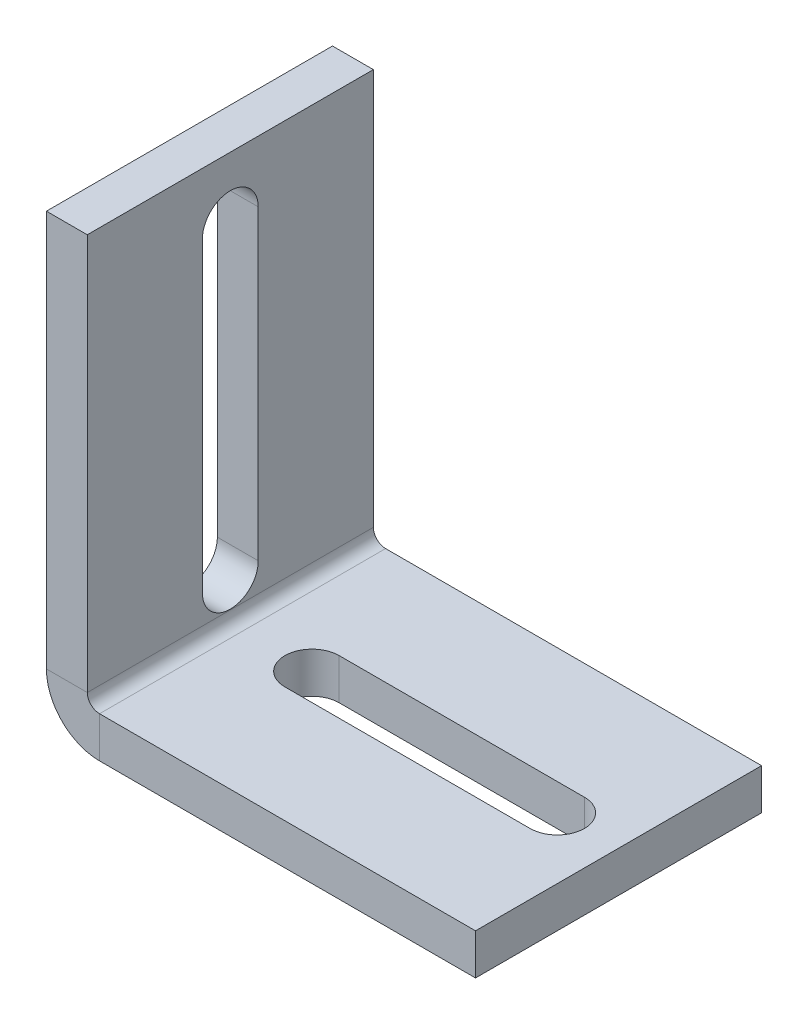
ISO-10303-21;
HEADER;
FILE_DESCRIPTION(('STEP AP214'),'2;1');
FILE_NAME('part.step','',(''),(''),'','','');
FILE_SCHEMA(('AUTOMOTIVE_DESIGN { 1 0 10303 214 1 1 1 1 }'));
ENDSEC;
DATA;
#1=APPLICATION_CONTEXT('core data for automotive mechanical design processes');
#2=APPLICATION_PROTOCOL_DEFINITION('international standard','automotive_design',2000,#1);
#3=PRODUCT_CONTEXT('',#1,'mechanical');
#4=PRODUCT('Part','Part','',(#3));
#5=PRODUCT_RELATED_PRODUCT_CATEGORY('part','',(#4));
#6=PRODUCT_DEFINITION_FORMATION('','',#4);
#7=PRODUCT_DEFINITION_CONTEXT('part definition',#1,'design');
#8=PRODUCT_DEFINITION('design','',#6,#7);
#9=PRODUCT_DEFINITION_SHAPE('','',#8);
#10=(LENGTH_UNIT() NAMED_UNIT(*) SI_UNIT(.MILLI.,.METRE.));
#11=(NAMED_UNIT(*) PLANE_ANGLE_UNIT() SI_UNIT($,.RADIAN.));
#12=(NAMED_UNIT(*) SI_UNIT($,.STERADIAN.) SOLID_ANGLE_UNIT());
#13=UNCERTAINTY_MEASURE_WITH_UNIT(LENGTH_MEASURE(1.E-05),#10,'distance_accuracy_value','');
#14=(GEOMETRIC_REPRESENTATION_CONTEXT(3) GLOBAL_UNCERTAINTY_ASSIGNED_CONTEXT((#13)) GLOBAL_UNIT_ASSIGNED_CONTEXT((#10,
#11,#12)) REPRESENTATION_CONTEXT('',''));
#15=CARTESIAN_POINT('',(0.,0.,0.));
#16=DIRECTION('',(0.,0.,1.));
#17=DIRECTION('',(1.,0.,0.));
#18=AXIS2_PLACEMENT_3D('',#15,#16,#17);
#19=CARTESIAN_POINT('',(30.,-30.,0.));
#20=DIRECTION('',(0.,-1.,0.));
#21=DIRECTION('',(0.,0.,-1.));
#22=AXIS2_PLACEMENT_3D('',#19,#20,#21);
#23=CYLINDRICAL_SURFACE('',#22,6.64034916170633);
#24=DIRECTION('',(0.,-1.,0.));
#25=VECTOR('',#24,1.);
#26=CARTESIAN_POINT('',(30.,-30.,-6.64034916170633));
#27=LINE('',#26,#25);
#28=CARTESIAN_POINT('',(30.,-20.,-6.64034916170633));
#29=VERTEX_POINT('',#28);
#30=CARTESIAN_POINT('',(30.,-30.,-6.64034916170633));
#31=VERTEX_POINT('',#30);
#32=EDGE_CURVE('E11',#29,#31,#27,.T.);
#33=ORIENTED_EDGE('',*,*,#32,.F.);
#34=CARTESIAN_POINT('',(30.,-20.,0.));
#35=DIRECTION('',(0.,-1.,0.));
#36=DIRECTION('',(0.,0.,-1.));
#37=AXIS2_PLACEMENT_3D('',#34,#35,#36);
#38=CIRCLE('',#37,6.64034916170633);
#39=CARTESIAN_POINT('',(30.,-20.,6.64034916170633));
#40=VERTEX_POINT('',#39);
#41=EDGE_CURVE('E135',#40,#29,#38,.T.);
#42=ORIENTED_EDGE('',*,*,#41,.F.);
#43=DIRECTION('',(0.,-1.,0.));
#44=VECTOR('',#43,1.);
#45=CARTESIAN_POINT('',(30.,-30.,6.64034916170633));
#46=LINE('',#45,#44);
#47=CARTESIAN_POINT('',(30.,-30.,6.64034916170633));
#48=VERTEX_POINT('',#47);
#49=EDGE_CURVE('E51',#40,#48,#46,.T.);
#50=ORIENTED_EDGE('',*,*,#49,.T.);
#51=CARTESIAN_POINT('',(30.,-30.,0.));
#52=DIRECTION('',(0.,-1.,0.));
#53=DIRECTION('',(0.,0.,-1.));
#54=AXIS2_PLACEMENT_3D('',#51,#52,#53);
#55=CIRCLE('',#54,6.64034916170633);
#56=EDGE_CURVE('E190',#48,#31,#55,.T.);
#57=ORIENTED_EDGE('',*,*,#56,.T.);
#58=EDGE_LOOP('',(#33,#42,#50,#57));
#59=FACE_BOUND('',#58,.T.);
#60=ADVANCED_FACE('F41',(#59),#23,.F.);
#61=CARTESIAN_POINT('',(0.,-30.,6.64034916170633));
#62=DIRECTION('',(0.,0.,1.));
#63=DIRECTION('',(1.,0.,0.));
#64=AXIS2_PLACEMENT_3D('',#61,#62,#63);
#65=PLANE('',#64);
#66=ORIENTED_EDGE('',*,*,#49,.F.);
#67=DIRECTION('',(1.,0.,0.));
#68=VECTOR('',#67,1.);
#69=CARTESIAN_POINT('',(7.9375,-20.,6.64034916170633));
#70=LINE('',#69,#68);
#71=CARTESIAN_POINT('',(90.,-20.,6.64034916170633));
#72=VERTEX_POINT('',#71);
#73=EDGE_CURVE('E148',#40,#72,#70,.T.);
#74=ORIENTED_EDGE('',*,*,#73,.T.);
#75=DIRECTION('',(0.,-1.,0.));
#76=VECTOR('',#75,1.);
#77=CARTESIAN_POINT('',(90.,-30.,6.64034916170633));
#78=LINE('',#77,#76);
#79=CARTESIAN_POINT('',(90.,-30.,6.64034916170633));
#80=VERTEX_POINT('',#79);
#81=EDGE_CURVE('E127',#72,#80,#78,.T.);
#82=ORIENTED_EDGE('',*,*,#81,.T.);
#83=DIRECTION('',(1.,0.,0.));
#84=VECTOR('',#83,1.);
#85=CARTESIAN_POINT('',(0.,-30.,6.64034916170633));
#86=LINE('',#85,#84);
#87=EDGE_CURVE('E198',#48,#80,#86,.T.);
#88=ORIENTED_EDGE('',*,*,#87,.F.);
#89=EDGE_LOOP('',(#66,#74,#82,#88));
#90=FACE_BOUND('',#89,.T.);
#91=ADVANCED_FACE('F200',(#90),#65,.F.);
#92=CARTESIAN_POINT('',(90.,-30.,0.));
#93=DIRECTION('',(0.,-1.,0.));
#94=DIRECTION('',(0.,0.,-1.));
#95=AXIS2_PLACEMENT_3D('',#92,#93,#94);
#96=CYLINDRICAL_SURFACE('',#95,6.64034916170633);
#97=ORIENTED_EDGE('',*,*,#81,.F.);
#98=CARTESIAN_POINT('',(90.,-20.,0.));
#99=DIRECTION('',(0.,-1.,0.));
#100=DIRECTION('',(0.,0.,-1.));
#101=AXIS2_PLACEMENT_3D('',#98,#99,#100);
#102=CIRCLE('',#101,6.64034916170633);
#103=CARTESIAN_POINT('',(90.,-20.,-6.64034916170633));
#104=VERTEX_POINT('',#103);
#105=EDGE_CURVE('E133',#104,#72,#102,.T.);
#106=ORIENTED_EDGE('',*,*,#105,.F.);
#107=DIRECTION('',(0.,-1.,0.));
#108=VECTOR('',#107,1.);
#109=CARTESIAN_POINT('',(90.,-30.,-6.64034916170633));
#110=LINE('',#109,#108);
#111=CARTESIAN_POINT('',(90.,-30.,-6.64034916170633));
#112=VERTEX_POINT('',#111);
#113=EDGE_CURVE('E45',#104,#112,#110,.T.);
#114=ORIENTED_EDGE('',*,*,#113,.T.);
#115=CARTESIAN_POINT('',(90.,-30.,0.));
#116=DIRECTION('',(0.,-1.,0.));
#117=DIRECTION('',(0.,0.,-1.));
#118=AXIS2_PLACEMENT_3D('',#115,#116,#117);
#119=CIRCLE('',#118,6.64034916170633);
#120=EDGE_CURVE('E321',#112,#80,#119,.T.);
#121=ORIENTED_EDGE('',*,*,#120,.T.);
#122=EDGE_LOOP('',(#97,#106,#114,#121));
#123=FACE_BOUND('',#122,.T.);
#124=ADVANCED_FACE('F137',(#123),#96,.F.);
#125=CARTESIAN_POINT('',(7.9375,-30.,-35.));
#126=DIRECTION('',(0.,0.,-1.));
#127=DIRECTION('',(-1.,0.,0.));
#128=AXIS2_PLACEMENT_3D('',#125,#126,#127);
#129=PLANE('',#128);
#130=DIRECTION('',(0.,-1.,0.));
#131=VECTOR('',#130,1.);
#132=CARTESIAN_POINT('',(13.,-30.,-35.));
#133=LINE('',#132,#131);
#134=CARTESIAN_POINT('',(13.,-20.,-35.));
#135=VERTEX_POINT('',#134);
#136=CARTESIAN_POINT('',(13.,-30.,-35.));
#137=VERTEX_POINT('',#136);
#138=EDGE_CURVE('E128',#135,#137,#133,.T.);
#139=ORIENTED_EDGE('',*,*,#138,.F.);
#140=DIRECTION('',(1.,0.,0.));
#141=VECTOR('',#140,1.);
#142=CARTESIAN_POINT('',(7.9375,-20.,-35.));
#143=LINE('',#142,#141);
#144=CARTESIAN_POINT('',(105.,-20.,-35.));
#145=VERTEX_POINT('',#144);
#146=EDGE_CURVE('E263',#145,#135,#143,.F.);
#147=ORIENTED_EDGE('',*,*,#146,.F.);
#148=DIRECTION('',(0.,-1.,0.));
#149=VECTOR('',#148,1.);
#150=CARTESIAN_POINT('',(105.,-30.,-35.));
#151=LINE('',#150,#149);
#152=CARTESIAN_POINT('',(105.,-30.,-35.));
#153=VERTEX_POINT('',#152);
#154=EDGE_CURVE('E179',#145,#153,#151,.T.);
#155=ORIENTED_EDGE('',*,*,#154,.T.);
#156=DIRECTION('',(-1.,0.,0.));
#157=VECTOR('',#156,1.);
#158=CARTESIAN_POINT('',(7.9375,-30.,-35.));
#159=LINE('',#158,#157);
#160=EDGE_CURVE('E236',#153,#137,#159,.T.);
#161=ORIENTED_EDGE('',*,*,#160,.T.);
#162=EDGE_LOOP('',(#139,#147,#155,#161));
#163=FACE_BOUND('',#162,.T.);
#164=ADVANCED_FACE('F312',(#163),#129,.T.);
#165=CARTESIAN_POINT('',(105.,-30.,0.));
#166=DIRECTION('',(1.,0.,0.));
#167=DIRECTION('',(0.,0.,-1.));
#168=AXIS2_PLACEMENT_3D('',#165,#166,#167);
#169=PLANE('',#168);
#170=ORIENTED_EDGE('',*,*,#154,.F.);
#171=DIRECTION('',(0.,0.,1.));
#172=VECTOR('',#171,1.);
#173=CARTESIAN_POINT('',(105.,-20.,0.));
#174=LINE('',#173,#172);
#175=CARTESIAN_POINT('',(105.,-20.,35.));
#176=VERTEX_POINT('',#175);
#177=EDGE_CURVE('E142',#176,#145,#174,.F.);
#178=ORIENTED_EDGE('',*,*,#177,.F.);
#179=DIRECTION('',(0.,-1.,0.));
#180=VECTOR('',#179,1.);
#181=CARTESIAN_POINT('',(105.,-30.,35.));
#182=LINE('',#181,#180);
#183=CARTESIAN_POINT('',(105.,-30.,35.));
#184=VERTEX_POINT('',#183);
#185=EDGE_CURVE('E176',#176,#184,#182,.T.);
#186=ORIENTED_EDGE('',*,*,#185,.T.);
#187=DIRECTION('',(0.,0.,-1.));
#188=VECTOR('',#187,1.);
#189=CARTESIAN_POINT('',(105.,-30.,0.));
#190=LINE('',#189,#188);
#191=EDGE_CURVE('E309',#184,#153,#190,.T.);
#192=ORIENTED_EDGE('',*,*,#191,.T.);
#193=EDGE_LOOP('',(#170,#178,#186,#192));
#194=FACE_BOUND('',#193,.T.);
#195=ADVANCED_FACE('F305',(#194),#169,.T.);
#196=CARTESIAN_POINT('',(7.9375,-30.,35.));
#197=DIRECTION('',(0.,0.,-1.));
#198=DIRECTION('',(-1.,0.,0.));
#199=AXIS2_PLACEMENT_3D('',#196,#197,#198);
#200=PLANE('',#199);
#201=ORIENTED_EDGE('',*,*,#185,.F.);
#202=DIRECTION('',(1.,0.,0.));
#203=VECTOR('',#202,1.);
#204=CARTESIAN_POINT('',(7.9375,-20.,35.));
#205=LINE('',#204,#203);
#206=CARTESIAN_POINT('',(13.,-20.,35.));
#207=VERTEX_POINT('',#206);
#208=EDGE_CURVE('E139',#176,#207,#205,.F.);
#209=ORIENTED_EDGE('',*,*,#208,.T.);
#210=DIRECTION('',(0.,-1.,0.));
#211=VECTOR('',#210,1.);
#212=CARTESIAN_POINT('',(13.,-30.,35.));
#213=LINE('',#212,#211);
#214=CARTESIAN_POINT('',(13.,-30.,35.));
#215=VERTEX_POINT('',#214);
#216=EDGE_CURVE('E173',#207,#215,#213,.T.);
#217=ORIENTED_EDGE('',*,*,#216,.T.);
#218=DIRECTION('',(-1.,0.,0.));
#219=VECTOR('',#218,1.);
#220=CARTESIAN_POINT('',(7.9375,-30.,35.));
#221=LINE('',#220,#219);
#222=EDGE_CURVE('E317',#184,#215,#221,.T.);
#223=ORIENTED_EDGE('',*,*,#222,.F.);
#224=EDGE_LOOP('',(#201,#209,#217,#223));
#225=FACE_BOUND('',#224,.T.);
#226=ADVANCED_FACE('F301',(#225),#200,.F.);
#227=CARTESIAN_POINT('',(13.,-17.,35.));
#228=DIRECTION('',(0.,0.,1.));
#229=DIRECTION('',(1.,0.,0.));
#230=AXIS2_PLACEMENT_3D('',#227,#228,#229);
#231=PLANE('',#230);
#232=ORIENTED_EDGE('',*,*,#216,.F.);
#233=CARTESIAN_POINT('',(13.,-17.,35.));
#234=DIRECTION('',(0.,0.,-1.));
#235=DIRECTION('',(-1.,0.,0.));
#236=AXIS2_PLACEMENT_3D('',#233,#234,#235);
#237=CIRCLE('',#236,3.);
#238=CARTESIAN_POINT('',(10.,-17.,35.));
#239=VERTEX_POINT('',#238);
#240=EDGE_CURVE('E262',#207,#239,#237,.T.);
#241=ORIENTED_EDGE('',*,*,#240,.T.);
#242=DIRECTION('',(-1.,0.,0.));
#243=VECTOR('',#242,1.);
#244=CARTESIAN_POINT('',(0.,-17.,35.));
#245=LINE('',#244,#243);
#246=CARTESIAN_POINT('',(0.,-17.,35.));
#247=VERTEX_POINT('',#246);
#248=EDGE_CURVE('E59',#239,#247,#245,.T.);
#249=ORIENTED_EDGE('',*,*,#248,.T.);
#250=CARTESIAN_POINT('',(13.,-17.,35.));
#251=DIRECTION('',(0.,0.,-1.));
#252=DIRECTION('',(-1.,0.,0.));
#253=AXIS2_PLACEMENT_3D('',#250,#251,#252);
#254=CIRCLE('',#253,13.);
#255=EDGE_CURVE('E233',#215,#247,#254,.T.);
#256=ORIENTED_EDGE('',*,*,#255,.F.);
#257=EDGE_LOOP('',(#232,#241,#249,#256));
#258=FACE_BOUND('',#257,.T.);
#259=ADVANCED_FACE('F299',(#258),#231,.T.);
#260=CARTESIAN_POINT('',(0.,0.,35.));
#261=DIRECTION('',(0.,0.,1.));
#262=DIRECTION('',(0.,-1.,0.));
#263=AXIS2_PLACEMENT_3D('',#260,#261,#262);
#264=PLANE('',#263);
#265=ORIENTED_EDGE('',*,*,#248,.F.);
#266=DIRECTION('',(0.,1.,0.));
#267=VECTOR('',#266,1.);
#268=CARTESIAN_POINT('',(10.,0.,35.));
#269=LINE('',#268,#267);
#270=CARTESIAN_POINT('',(10.,80.,35.));
#271=VERTEX_POINT('',#270);
#272=EDGE_CURVE('E257',#271,#239,#269,.F.);
#273=ORIENTED_EDGE('',*,*,#272,.F.);
#274=DIRECTION('',(-1.,0.,0.));
#275=VECTOR('',#274,1.);
#276=CARTESIAN_POINT('',(0.,80.,35.));
#277=LINE('',#276,#275);
#278=CARTESIAN_POINT('',(0.,80.,35.));
#279=VERTEX_POINT('',#278);
#280=EDGE_CURVE('E169',#271,#279,#277,.T.);
#281=ORIENTED_EDGE('',*,*,#280,.T.);
#282=DIRECTION('',(0.,-1.,0.));
#283=VECTOR('',#282,1.);
#284=CARTESIAN_POINT('',(0.,0.,35.));
#285=LINE('',#284,#283);
#286=EDGE_CURVE('E219',#279,#247,#285,.T.);
#287=ORIENTED_EDGE('',*,*,#286,.T.);
#288=EDGE_LOOP('',(#265,#273,#281,#287));
#289=FACE_BOUND('',#288,.T.);
#290=ADVANCED_FACE('F298',(#289),#264,.T.);
#291=CARTESIAN_POINT('',(0.,80.,0.));
#292=DIRECTION('',(0.,-1.,0.));
#293=DIRECTION('',(0.,0.,-1.));
#294=AXIS2_PLACEMENT_3D('',#291,#292,#293);
#295=PLANE('',#294);
#296=ORIENTED_EDGE('',*,*,#280,.F.);
#297=DIRECTION('',(0.,0.,-1.));
#298=VECTOR('',#297,1.);
#299=CARTESIAN_POINT('',(10.,80.,0.));
#300=LINE('',#299,#298);
#301=CARTESIAN_POINT('',(10.,80.,-35.));
#302=VERTEX_POINT('',#301);
#303=EDGE_CURVE('E242',#271,#302,#300,.T.);
#304=ORIENTED_EDGE('',*,*,#303,.T.);
#305=DIRECTION('',(-1.,0.,0.));
#306=VECTOR('',#305,1.);
#307=CARTESIAN_POINT('',(0.,80.,-35.));
#308=LINE('',#307,#306);
#309=CARTESIAN_POINT('',(0.,80.,-35.));
#310=VERTEX_POINT('',#309);
#311=EDGE_CURVE('E166',#302,#310,#308,.T.);
#312=ORIENTED_EDGE('',*,*,#311,.T.);
#313=DIRECTION('',(0.,0.,-1.));
#314=VECTOR('',#313,1.);
#315=CARTESIAN_POINT('',(0.,80.,0.));
#316=LINE('',#315,#314);
#317=EDGE_CURVE('E222',#279,#310,#316,.T.);
#318=ORIENTED_EDGE('',*,*,#317,.F.);
#319=EDGE_LOOP('',(#296,#304,#312,#318));
#320=FACE_BOUND('',#319,.T.);
#321=ADVANCED_FACE('F291',(#320),#295,.F.);
#322=CARTESIAN_POINT('',(0.,0.,-35.));
#323=DIRECTION('',(0.,0.,1.));
#324=DIRECTION('',(0.,-1.,0.));
#325=AXIS2_PLACEMENT_3D('',#322,#323,#324);
#326=PLANE('',#325);
#327=ORIENTED_EDGE('',*,*,#311,.F.);
#328=DIRECTION('',(0.,1.,0.));
#329=VECTOR('',#328,1.);
#330=CARTESIAN_POINT('',(10.,0.,-35.));
#331=LINE('',#330,#329);
#332=CARTESIAN_POINT('',(10.,-17.,-35.));
#333=VERTEX_POINT('',#332);
#334=EDGE_CURVE('E249',#302,#333,#331,.F.);
#335=ORIENTED_EDGE('',*,*,#334,.T.);
#336=DIRECTION('',(-1.,0.,0.));
#337=VECTOR('',#336,1.);
#338=CARTESIAN_POINT('',(0.,-17.,-35.));
#339=LINE('',#338,#337);
#340=CARTESIAN_POINT('',(0.,-17.,-35.));
#341=VERTEX_POINT('',#340);
#342=EDGE_CURVE('E162',#333,#341,#339,.T.);
#343=ORIENTED_EDGE('',*,*,#342,.T.);
#344=DIRECTION('',(0.,-1.,0.));
#345=VECTOR('',#344,1.);
#346=CARTESIAN_POINT('',(0.,0.,-35.));
#347=LINE('',#346,#345);
#348=EDGE_CURVE('E216',#310,#341,#347,.T.);
#349=ORIENTED_EDGE('',*,*,#348,.F.);
#350=EDGE_LOOP('',(#327,#335,#343,#349));
#351=FACE_BOUND('',#350,.T.);
#352=ADVANCED_FACE('F285',(#351),#326,.F.);
#353=CARTESIAN_POINT('',(0.,65.,0.));
#354=DIRECTION('',(1.,0.,0.));
#355=DIRECTION('',(0.,0.,-1.));
#356=AXIS2_PLACEMENT_3D('',#353,#354,#355);
#357=CYLINDRICAL_SURFACE('',#356,6.83482912030963);
#358=DIRECTION('',(-1.,0.,0.));
#359=VECTOR('',#358,1.);
#360=CARTESIAN_POINT('',(0.,65.,-6.83482912030963));
#361=LINE('',#360,#359);
#362=CARTESIAN_POINT('',(10.,65.,-6.83482912030963));
#363=VERTEX_POINT('',#362);
#364=CARTESIAN_POINT('',(0.,65.,-6.83482912030963));
#365=VERTEX_POINT('',#364);
#366=EDGE_CURVE('E159',#363,#365,#361,.T.);
#367=ORIENTED_EDGE('',*,*,#366,.F.);
#368=CARTESIAN_POINT('',(10.,65.,0.));
#369=DIRECTION('',(1.,0.,0.));
#370=DIRECTION('',(0.,0.,-1.));
#371=AXIS2_PLACEMENT_3D('',#368,#369,#370);
#372=CIRCLE('',#371,6.83482912030963);
#373=CARTESIAN_POINT('',(10.,65.,6.83482912030963));
#374=VERTEX_POINT('',#373);
#375=EDGE_CURVE('E250',#363,#374,#372,.T.);
#376=ORIENTED_EDGE('',*,*,#375,.T.);
#377=DIRECTION('',(-1.,0.,0.));
#378=VECTOR('',#377,1.);
#379=CARTESIAN_POINT('',(0.,65.,6.83482912030963));
#380=LINE('',#379,#378);
#381=CARTESIAN_POINT('',(0.,65.,6.83482912030963));
#382=VERTEX_POINT('',#381);
#383=EDGE_CURVE('E155',#374,#382,#380,.T.);
#384=ORIENTED_EDGE('',*,*,#383,.T.);
#385=CARTESIAN_POINT('',(0.,65.,0.));
#386=DIRECTION('',(1.,0.,0.));
#387=DIRECTION('',(0.,0.,-1.));
#388=AXIS2_PLACEMENT_3D('',#385,#386,#387);
#389=CIRCLE('',#388,6.83482912030963);
#390=EDGE_CURVE('E210',#365,#382,#389,.T.);
#391=ORIENTED_EDGE('',*,*,#390,.F.);
#392=EDGE_LOOP('',(#367,#376,#384,#391));
#393=FACE_BOUND('',#392,.T.);
#394=ADVANCED_FACE('F351',(#393),#357,.F.);
#395=CARTESIAN_POINT('',(0.,0.,6.83482912030962));
#396=DIRECTION('',(0.,0.,1.));
#397=DIRECTION('',(0.,-1.,0.));
#398=AXIS2_PLACEMENT_3D('',#395,#396,#397);
#399=PLANE('',#398);
#400=ORIENTED_EDGE('',*,*,#383,.F.);
#401=DIRECTION('',(0.,1.,0.));
#402=VECTOR('',#401,1.);
#403=CARTESIAN_POINT('',(10.,0.,6.83482912030963));
#404=LINE('',#403,#402);
#405=CARTESIAN_POINT('',(10.,-10.,6.83482912030962));
#406=VERTEX_POINT('',#405);
#407=EDGE_CURVE('E246',#374,#406,#404,.F.);
#408=ORIENTED_EDGE('',*,*,#407,.T.);
#409=DIRECTION('',(-1.,0.,0.));
#410=VECTOR('',#409,1.);
#411=CARTESIAN_POINT('',(0.,-10.,6.83482912030962));
#412=LINE('',#411,#410);
#413=CARTESIAN_POINT('',(0.,-10.,6.83482912030962));
#414=VERTEX_POINT('',#413);
#415=EDGE_CURVE('E152',#406,#414,#412,.T.);
#416=ORIENTED_EDGE('',*,*,#415,.T.);
#417=DIRECTION('',(0.,-1.,0.));
#418=VECTOR('',#417,1.);
#419=CARTESIAN_POINT('',(0.,0.,6.83482912030962));
#420=LINE('',#419,#418);
#421=EDGE_CURVE('E213',#382,#414,#420,.T.);
#422=ORIENTED_EDGE('',*,*,#421,.F.);
#423=EDGE_LOOP('',(#400,#408,#416,#422));
#424=FACE_BOUND('',#423,.T.);
#425=ADVANCED_FACE('F340',(#424),#399,.F.);
#426=CARTESIAN_POINT('',(0.,-9.99999999999999,0.));
#427=DIRECTION('',(1.,0.,0.));
#428=DIRECTION('',(0.,0.,-1.));
#429=AXIS2_PLACEMENT_3D('',#426,#427,#428);
#430=CYLINDRICAL_SURFACE('',#429,6.83482912030963);
#431=ORIENTED_EDGE('',*,*,#415,.F.);
#432=CARTESIAN_POINT('',(10.,-9.99999999999999,0.));
#433=DIRECTION('',(1.,0.,0.));
#434=DIRECTION('',(0.,0.,-1.));
#435=AXIS2_PLACEMENT_3D('',#432,#433,#434);
#436=CIRCLE('',#435,6.83482912030963);
#437=CARTESIAN_POINT('',(10.,-9.99999999999999,-6.83482912030964));
#438=VERTEX_POINT('',#437);
#439=EDGE_CURVE('E150',#406,#438,#436,.T.);
#440=ORIENTED_EDGE('',*,*,#439,.T.);
#441=DIRECTION('',(-1.,0.,0.));
#442=VECTOR('',#441,1.);
#443=CARTESIAN_POINT('',(0.,-9.99999999999999,-6.83482912030964));
#444=LINE('',#443,#442);
#445=CARTESIAN_POINT('',(0.,-9.99999999999999,-6.83482912030964));
#446=VERTEX_POINT('',#445);
#447=EDGE_CURVE('E156',#438,#446,#444,.T.);
#448=ORIENTED_EDGE('',*,*,#447,.T.);
#449=CARTESIAN_POINT('',(0.,-9.99999999999999,0.));
#450=DIRECTION('',(1.,0.,0.));
#451=DIRECTION('',(0.,0.,-1.));
#452=AXIS2_PLACEMENT_3D('',#449,#450,#451);
#453=CIRCLE('',#452,6.83482912030963);
#454=EDGE_CURVE('E201',#414,#446,#453,.T.);
#455=ORIENTED_EDGE('',*,*,#454,.F.);
#456=EDGE_LOOP('',(#431,#440,#448,#455));
#457=FACE_BOUND('',#456,.T.);
#458=ADVANCED_FACE('F344',(#457),#430,.F.);
#459=CARTESIAN_POINT('',(0.,-30.,-6.64034916170633));
#460=DIRECTION('',(0.,0.,1.));
#461=DIRECTION('',(1.,0.,0.));
#462=AXIS2_PLACEMENT_3D('',#459,#460,#461);
#463=PLANE('',#462);
#464=DIRECTION('',(1.,0.,0.));
#465=VECTOR('',#464,1.);
#466=CARTESIAN_POINT('',(7.9375,-20.,-6.64034916170633));
#467=LINE('',#466,#465);
#468=EDGE_CURVE('E119',#29,#104,#467,.T.);
#469=ORIENTED_EDGE('',*,*,#468,.F.);
#470=ORIENTED_EDGE('',*,*,#32,.T.);
#471=DIRECTION('',(1.,0.,0.));
#472=VECTOR('',#471,1.);
#473=CARTESIAN_POINT('',(0.,-30.,-6.64034916170633));
#474=LINE('',#473,#472);
#475=EDGE_CURVE('E122',#31,#112,#474,.T.);
#476=ORIENTED_EDGE('',*,*,#475,.T.);
#477=ORIENTED_EDGE('',*,*,#113,.F.);
#478=EDGE_LOOP('',(#469,#470,#476,#477));
#479=FACE_BOUND('',#478,.T.);
#480=ADVANCED_FACE('F43',(#479),#463,.T.);
#481=CARTESIAN_POINT('',(0.,0.,-6.83482912030964));
#482=DIRECTION('',(0.,0.,1.));
#483=DIRECTION('',(0.,-1.,0.));
#484=AXIS2_PLACEMENT_3D('',#481,#482,#483);
#485=PLANE('',#484);
#486=DIRECTION('',(0.,1.,0.));
#487=VECTOR('',#486,1.);
#488=CARTESIAN_POINT('',(10.,0.,-6.83482912030963));
#489=LINE('',#488,#487);
#490=EDGE_CURVE('E245',#363,#438,#489,.F.);
#491=ORIENTED_EDGE('',*,*,#490,.F.);
#492=ORIENTED_EDGE('',*,*,#366,.T.);
#493=DIRECTION('',(0.,-1.,0.));
#494=VECTOR('',#493,1.);
#495=CARTESIAN_POINT('',(0.,0.,-6.83482912030964));
#496=LINE('',#495,#494);
#497=EDGE_CURVE('E204',#365,#446,#496,.T.);
#498=ORIENTED_EDGE('',*,*,#497,.T.);
#499=ORIENTED_EDGE('',*,*,#447,.F.);
#500=EDGE_LOOP('',(#491,#492,#498,#499));
#501=FACE_BOUND('',#500,.T.);
#502=ADVANCED_FACE('F356',(#501),#485,.T.);
#503=CARTESIAN_POINT('',(13.,-17.,-35.));
#504=DIRECTION('',(0.,0.,-1.));
#505=DIRECTION('',(-1.,0.,0.));
#506=AXIS2_PLACEMENT_3D('',#503,#504,#505);
#507=PLANE('',#506);
#508=CARTESIAN_POINT('',(13.,-17.,-35.));
#509=DIRECTION('',(0.,0.,-1.));
#510=DIRECTION('',(-1.,0.,0.));
#511=AXIS2_PLACEMENT_3D('',#508,#509,#510);
#512=CIRCLE('',#511,3.);
#513=EDGE_CURVE('E146',#333,#135,#512,.F.);
#514=ORIENTED_EDGE('',*,*,#513,.T.);
#515=ORIENTED_EDGE('',*,*,#138,.T.);
#516=CARTESIAN_POINT('',(13.,-17.,-35.));
#517=DIRECTION('',(0.,0.,1.));
#518=DIRECTION('',(1.,0.,0.));
#519=AXIS2_PLACEMENT_3D('',#516,#517,#518);
#520=CIRCLE('',#519,13.);
#521=EDGE_CURVE('E230',#341,#137,#520,.T.);
#522=ORIENTED_EDGE('',*,*,#521,.F.);
#523=ORIENTED_EDGE('',*,*,#342,.F.);
#524=EDGE_LOOP('',(#514,#515,#522,#523));
#525=FACE_BOUND('',#524,.T.);
#526=ADVANCED_FACE('F277',(#525),#507,.T.);
#527=CARTESIAN_POINT('',(0.,0.,0.));
#528=DIRECTION('',(1.,0.,0.));
#529=DIRECTION('',(0.,0.,-1.));
#530=AXIS2_PLACEMENT_3D('',#527,#528,#529);
#531=PLANE('',#530);
#532=ORIENTED_EDGE('',*,*,#454,.T.);
#533=ORIENTED_EDGE('',*,*,#497,.F.);
#534=ORIENTED_EDGE('',*,*,#390,.T.);
#535=ORIENTED_EDGE('',*,*,#421,.T.);
#536=EDGE_LOOP('',(#532,#533,#534,#535));
#537=FACE_BOUND('',#536,.T.);
#538=ORIENTED_EDGE('',*,*,#348,.T.);
#539=DIRECTION('',(0.,0.,-1.));
#540=VECTOR('',#539,1.);
#541=CARTESIAN_POINT('',(0.,-17.,0.));
#542=LINE('',#541,#540);
#543=EDGE_CURVE('E165',#341,#247,#542,.F.);
#544=ORIENTED_EDGE('',*,*,#543,.T.);
#545=ORIENTED_EDGE('',*,*,#286,.F.);
#546=ORIENTED_EDGE('',*,*,#317,.T.);
#547=EDGE_LOOP('',(#538,#544,#545,#546));
#548=FACE_BOUND('',#547,.T.);
#549=ADVANCED_FACE('F347',(#537,#548),#531,.F.);
#550=CARTESIAN_POINT('',(7.9375,-30.,0.));
#551=DIRECTION('',(0.,1.,0.));
#552=DIRECTION('',(0.,0.,1.));
#553=AXIS2_PLACEMENT_3D('',#550,#551,#552);
#554=PLANE('',#553);
#555=ORIENTED_EDGE('',*,*,#222,.T.);
#556=DIRECTION('',(0.,0.,-1.));
#557=VECTOR('',#556,1.);
#558=CARTESIAN_POINT('',(13.,-30.,0.));
#559=LINE('',#558,#557);
#560=EDGE_CURVE('E225',#215,#137,#559,.T.);
#561=ORIENTED_EDGE('',*,*,#560,.T.);
#562=ORIENTED_EDGE('',*,*,#160,.F.);
#563=ORIENTED_EDGE('',*,*,#191,.F.);
#564=EDGE_LOOP('',(#555,#561,#562,#563));
#565=FACE_BOUND('',#564,.T.);
#566=ORIENTED_EDGE('',*,*,#120,.F.);
#567=ORIENTED_EDGE('',*,*,#475,.F.);
#568=ORIENTED_EDGE('',*,*,#56,.F.);
#569=ORIENTED_EDGE('',*,*,#87,.T.);
#570=EDGE_LOOP('',(#566,#567,#568,#569));
#571=FACE_BOUND('',#570,.T.);
#572=ADVANCED_FACE('F197',(#565,#571),#554,.F.);
#573=CARTESIAN_POINT('',(13.,-17.,0.));
#574=DIRECTION('',(0.,0.,-1.));
#575=DIRECTION('',(-1.,0.,0.));
#576=AXIS2_PLACEMENT_3D('',#573,#574,#575);
#577=CYLINDRICAL_SURFACE('',#576,13.);
#578=ORIENTED_EDGE('',*,*,#255,.T.);
#579=ORIENTED_EDGE('',*,*,#543,.F.);
#580=ORIENTED_EDGE('',*,*,#521,.T.);
#581=ORIENTED_EDGE('',*,*,#560,.F.);
#582=EDGE_LOOP('',(#578,#579,#580,#581));
#583=FACE_BOUND('',#582,.T.);
#584=ADVANCED_FACE('F402',(#583),#577,.T.);
#585=CARTESIAN_POINT('',(10.,0.,0.));
#586=DIRECTION('',(1.,0.,0.));
#587=DIRECTION('',(0.,0.,-1.));
#588=AXIS2_PLACEMENT_3D('',#585,#586,#587);
#589=PLANE('',#588);
#590=ORIENTED_EDGE('',*,*,#439,.F.);
#591=ORIENTED_EDGE('',*,*,#407,.F.);
#592=ORIENTED_EDGE('',*,*,#375,.F.);
#593=ORIENTED_EDGE('',*,*,#490,.T.);
#594=EDGE_LOOP('',(#590,#591,#592,#593));
#595=FACE_BOUND('',#594,.T.);
#596=ORIENTED_EDGE('',*,*,#334,.F.);
#597=ORIENTED_EDGE('',*,*,#303,.F.);
#598=ORIENTED_EDGE('',*,*,#272,.T.);
#599=DIRECTION('',(0.,0.,-1.));
#600=VECTOR('',#599,1.);
#601=CARTESIAN_POINT('',(10.,-17.,0.));
#602=LINE('',#601,#600);
#603=EDGE_CURVE('E234',#333,#239,#602,.F.);
#604=ORIENTED_EDGE('',*,*,#603,.F.);
#605=EDGE_LOOP('',(#596,#597,#598,#604));
#606=FACE_BOUND('',#605,.T.);
#607=ADVANCED_FACE('F289',(#595,#606),#589,.T.);
#608=CARTESIAN_POINT('',(7.9375,-20.,0.));
#609=DIRECTION('',(0.,1.,0.));
#610=DIRECTION('',(0.,0.,1.));
#611=AXIS2_PLACEMENT_3D('',#608,#609,#610);
#612=PLANE('',#611);
#613=ORIENTED_EDGE('',*,*,#208,.F.);
#614=ORIENTED_EDGE('',*,*,#177,.T.);
#615=ORIENTED_EDGE('',*,*,#146,.T.);
#616=DIRECTION('',(0.,0.,1.));
#617=VECTOR('',#616,1.);
#618=CARTESIAN_POINT('',(13.,-20.,0.));
#619=LINE('',#618,#617);
#620=EDGE_CURVE('E239',#207,#135,#619,.F.);
#621=ORIENTED_EDGE('',*,*,#620,.F.);
#622=EDGE_LOOP('',(#613,#614,#615,#621));
#623=FACE_BOUND('',#622,.T.);
#624=ORIENTED_EDGE('',*,*,#105,.T.);
#625=ORIENTED_EDGE('',*,*,#73,.F.);
#626=ORIENTED_EDGE('',*,*,#41,.T.);
#627=ORIENTED_EDGE('',*,*,#468,.T.);
#628=EDGE_LOOP('',(#624,#625,#626,#627));
#629=FACE_BOUND('',#628,.T.);
#630=ADVANCED_FACE('F131',(#623,#629),#612,.T.);
#631=CARTESIAN_POINT('',(13.,-17.,0.));
#632=DIRECTION('',(0.,0.,-1.));
#633=DIRECTION('',(-1.,0.,0.));
#634=AXIS2_PLACEMENT_3D('',#631,#632,#633);
#635=CYLINDRICAL_SURFACE('',#634,3.);
#636=ORIENTED_EDGE('',*,*,#240,.F.);
#637=ORIENTED_EDGE('',*,*,#620,.T.);
#638=ORIENTED_EDGE('',*,*,#513,.F.);
#639=ORIENTED_EDGE('',*,*,#603,.T.);
#640=EDGE_LOOP('',(#636,#637,#638,#639));
#641=FACE_BOUND('',#640,.T.);
#642=ADVANCED_FACE('F282',(#641),#635,.F.);
#643=CLOSED_SHELL('',(#60,#91,#124,#164,#195,#226,#259,#290,#321,#352,#394,#425,#458,#480,#502,
#526,#549,#572,#584,#607,#630,#642));
#644=MANIFOLD_SOLID_BREP('B2',#643);
#645=ADVANCED_BREP_SHAPE_REPRESENTATION('',(#18,#644),#14);
#646=SHAPE_DEFINITION_REPRESENTATION(#9,#645);
ENDSEC;
END-ISO-10303-21;
